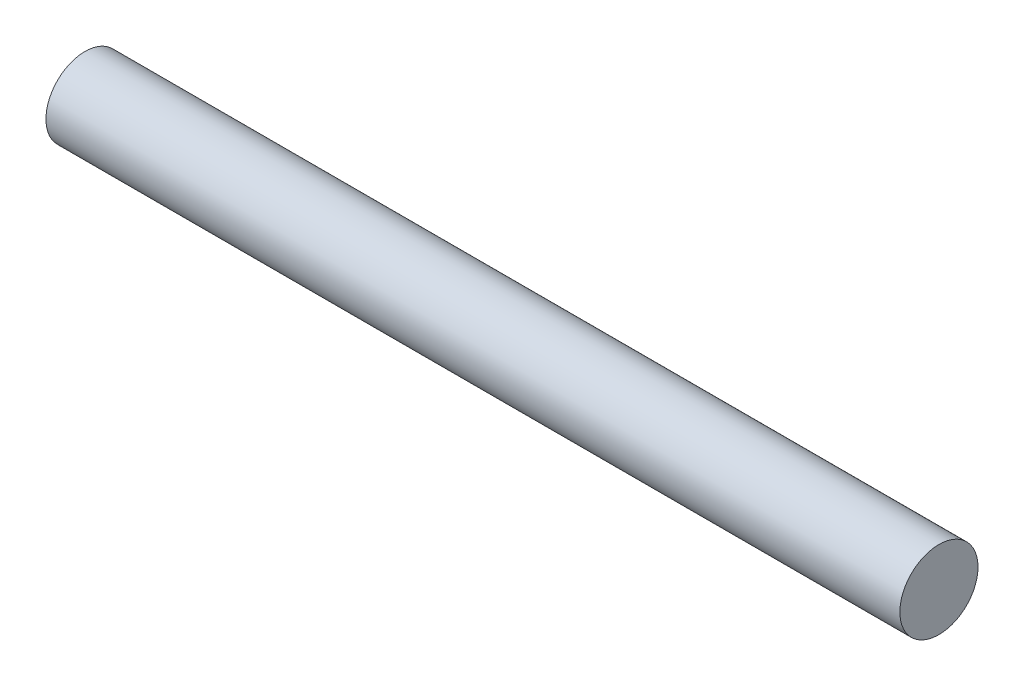
ISO-10303-21;
HEADER;
FILE_DESCRIPTION(('STEP AP214'),'2;1');
FILE_NAME('part.step','',(''),(''),'','','');
FILE_SCHEMA(('AUTOMOTIVE_DESIGN { 1 0 10303 214 1 1 1 1 }'));
ENDSEC;
DATA;
#1=APPLICATION_CONTEXT('core data for automotive mechanical design processes');
#2=APPLICATION_PROTOCOL_DEFINITION('international standard','automotive_design',2000,#1);
#3=PRODUCT_CONTEXT('',#1,'mechanical');
#4=PRODUCT('Part','Part','',(#3));
#5=PRODUCT_RELATED_PRODUCT_CATEGORY('part','',(#4));
#6=PRODUCT_DEFINITION_FORMATION('','',#4);
#7=PRODUCT_DEFINITION_CONTEXT('part definition',#1,'design');
#8=PRODUCT_DEFINITION('design','',#6,#7);
#9=PRODUCT_DEFINITION_SHAPE('','',#8);
#10=(LENGTH_UNIT() NAMED_UNIT(*) SI_UNIT(.MILLI.,.METRE.));
#11=(NAMED_UNIT(*) PLANE_ANGLE_UNIT() SI_UNIT($,.RADIAN.));
#12=(NAMED_UNIT(*) SI_UNIT($,.STERADIAN.) SOLID_ANGLE_UNIT());
#13=UNCERTAINTY_MEASURE_WITH_UNIT(LENGTH_MEASURE(1.E-05),#10,'distance_accuracy_value','');
#14=(GEOMETRIC_REPRESENTATION_CONTEXT(3) GLOBAL_UNCERTAINTY_ASSIGNED_CONTEXT((#13)) GLOBAL_UNIT_ASSIGNED_CONTEXT((#10,
#11,#12)) REPRESENTATION_CONTEXT('',''));
#15=CARTESIAN_POINT('',(0.,0.,0.));
#16=DIRECTION('',(0.,0.,1.));
#17=DIRECTION('',(1.,0.,0.));
#18=AXIS2_PLACEMENT_3D('',#15,#16,#17);
#19=CARTESIAN_POINT('',(76.5,0.,0.));
#20=DIRECTION('',(-1.,0.,0.));
#21=DIRECTION('',(0.,0.,1.));
#22=AXIS2_PLACEMENT_3D('',#19,#20,#21);
#23=CYLINDRICAL_SURFACE('',#22,3.5);
#24=CARTESIAN_POINT('',(76.5,0.,0.));
#25=DIRECTION('',(1.,0.,0.));
#26=DIRECTION('',(0.,0.,-1.));
#27=AXIS2_PLACEMENT_3D('',#24,#25,#26);
#28=CIRCLE('',#27,3.5);
#29=CARTESIAN_POINT('',(76.5,0.,-3.5));
#30=VERTEX_POINT('',#29);
#31=EDGE_CURVE('E10',#30,#30,#28,.T.);
#32=ORIENTED_EDGE('',*,*,#31,.F.);
#33=EDGE_LOOP('',(#32));
#34=FACE_BOUND('',#33,.T.);
#35=CARTESIAN_POINT('',(0.,0.,0.));
#36=DIRECTION('',(1.,0.,0.));
#37=DIRECTION('',(0.,0.,-1.));
#38=AXIS2_PLACEMENT_3D('',#35,#36,#37);
#39=CIRCLE('',#38,3.5);
#40=CARTESIAN_POINT('',(0.,0.,-3.5));
#41=VERTEX_POINT('',#40);
#42=EDGE_CURVE('E37',#41,#41,#39,.T.);
#43=ORIENTED_EDGE('',*,*,#42,.T.);
#44=EDGE_LOOP('',(#43));
#45=FACE_BOUND('',#44,.T.);
#46=ADVANCED_FACE('F34',(#34,#45),#23,.T.);
#47=CARTESIAN_POINT('',(76.5,0.,0.));
#48=DIRECTION('',(1.,0.,0.));
#49=DIRECTION('',(0.,0.,-1.));
#50=AXIS2_PLACEMENT_3D('',#47,#48,#49);
#51=PLANE('',#50);
#52=ORIENTED_EDGE('',*,*,#31,.T.);
#53=EDGE_LOOP('',(#52));
#54=FACE_BOUND('',#53,.T.);
#55=ADVANCED_FACE('F53',(#54),#51,.T.);
#56=CARTESIAN_POINT('',(0.,0.,0.));
#57=DIRECTION('',(1.,0.,0.));
#58=DIRECTION('',(0.,0.,-1.));
#59=AXIS2_PLACEMENT_3D('',#56,#57,#58);
#60=PLANE('',#59);
#61=ORIENTED_EDGE('',*,*,#42,.F.);
#62=EDGE_LOOP('',(#61));
#63=FACE_BOUND('',#62,.T.);
#64=ADVANCED_FACE('F51',(#63),#60,.F.);
#65=CLOSED_SHELL('',(#46,#55,#64));
#66=MANIFOLD_SOLID_BREP('B2',#65);
#67=ADVANCED_BREP_SHAPE_REPRESENTATION('',(#18,#66),#14);
#68=SHAPE_DEFINITION_REPRESENTATION(#9,#67);
ENDSEC;
END-ISO-10303-21;
